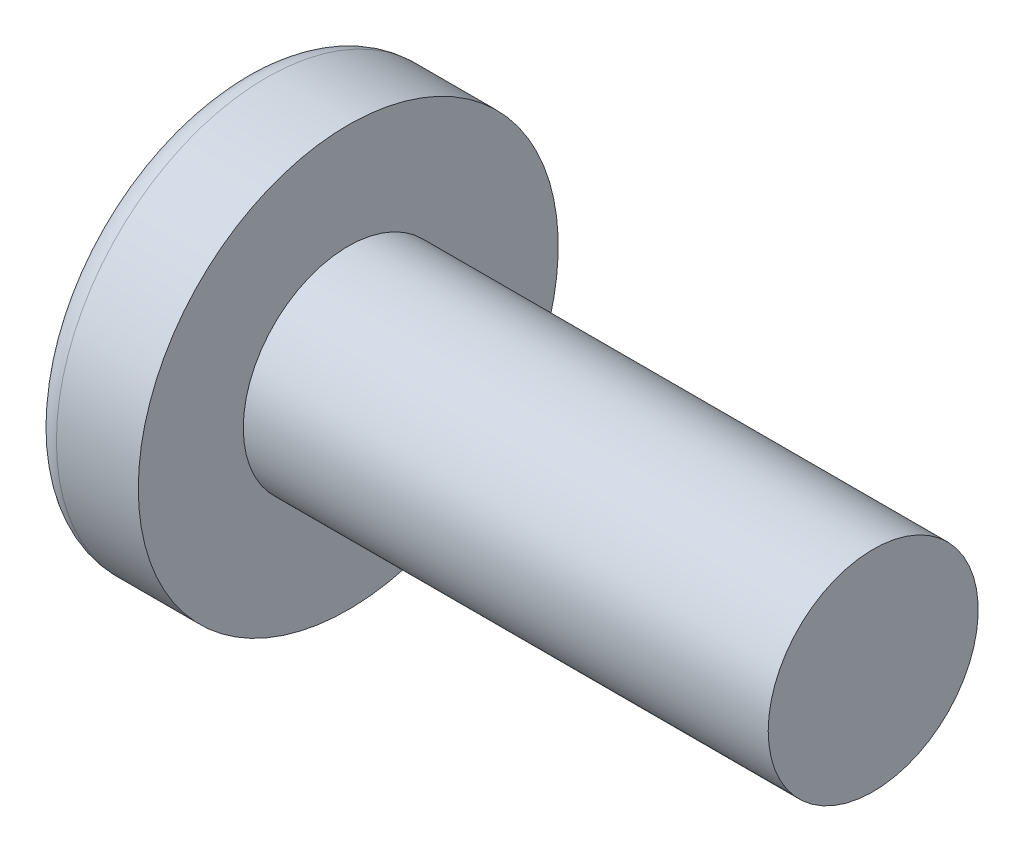
ISO-10303-21;
HEADER;
FILE_DESCRIPTION(('STEP AP214'),'2;1');
FILE_NAME('part.step','',(''),(''),'','','');
FILE_SCHEMA(('AUTOMOTIVE_DESIGN { 1 0 10303 214 1 1 1 1 }'));
ENDSEC;
DATA;
#1=APPLICATION_CONTEXT('core data for automotive mechanical design processes');
#2=APPLICATION_PROTOCOL_DEFINITION('international standard','automotive_design',2000,#1);
#3=PRODUCT_CONTEXT('',#1,'mechanical');
#4=PRODUCT('Part','Part','',(#3));
#5=PRODUCT_RELATED_PRODUCT_CATEGORY('part','',(#4));
#6=PRODUCT_DEFINITION_FORMATION('','',#4);
#7=PRODUCT_DEFINITION_CONTEXT('part definition',#1,'design');
#8=PRODUCT_DEFINITION('design','',#6,#7);
#9=PRODUCT_DEFINITION_SHAPE('','',#8);
#10=(LENGTH_UNIT() NAMED_UNIT(*) SI_UNIT(.MILLI.,.METRE.));
#11=(NAMED_UNIT(*) PLANE_ANGLE_UNIT() SI_UNIT($,.RADIAN.));
#12=(NAMED_UNIT(*) SI_UNIT($,.STERADIAN.) SOLID_ANGLE_UNIT());
#13=UNCERTAINTY_MEASURE_WITH_UNIT(LENGTH_MEASURE(1.E-05),#10,'distance_accuracy_value','');
#14=(GEOMETRIC_REPRESENTATION_CONTEXT(3) GLOBAL_UNCERTAINTY_ASSIGNED_CONTEXT((#13)) GLOBAL_UNIT_ASSIGNED_CONTEXT((#10,
#11,#12)) REPRESENTATION_CONTEXT('',''));
#15=CARTESIAN_POINT('',(0.,0.,0.));
#16=DIRECTION('',(0.,0.,1.));
#17=DIRECTION('',(1.,0.,0.));
#18=AXIS2_PLACEMENT_3D('',#15,#16,#17);
#19=CARTESIAN_POINT('',(3.2,0.,0.));
#20=DIRECTION('',(-1.,0.,0.));
#21=DIRECTION('',(0.,1.,0.));
#22=AXIS2_PLACEMENT_3D('',#19,#20,#21);
#23=SPHERICAL_SURFACE('',#22,3.2);
#24=CARTESIAN_POINT('',(0.627117875780583,0.,0.));
#25=DIRECTION('',(-1.,0.,0.));
#26=DIRECTION('',(0.,0.,1.));
#27=AXIS2_PLACEMENT_3D('',#24,#25,#26);
#28=CIRCLE('',#27,1.9027027027027);
#29=CARTESIAN_POINT('',(0.627117875780583,0.,1.9027027027027));
#30=VERTEX_POINT('',#29);
#31=EDGE_CURVE('E153',#30,#30,#28,.T.);
#32=ORIENTED_EDGE('',*,*,#31,.T.);
#33=EDGE_LOOP('',(#32));
#34=FACE_BOUND('',#33,.T.);
#35=CARTESIAN_POINT('',(3.19174554351625,-0.0818566934638239,0.));
#36=DIRECTION('',(-0.100331502261418,-0.994954064092392,0.));
#37=DIRECTION('',(0.994954064092392,-0.100331502261418,0.));
#38=AXIS2_PLACEMENT_3D('',#35,#36,#37);
#39=CIRCLE('',#38,3.1989422229361);
#40=CARTESIAN_POINT('',(0.118330716626357,0.228067490760365,0.83144431417242));
#41=VERTEX_POINT('',#40);
#42=CARTESIAN_POINT('',(0.0177814447975956,0.238206913129653,0.238206913129654));
#43=VERTEX_POINT('',#42);
#44=EDGE_CURVE('E184',#41,#43,#39,.T.);
#45=ORIENTED_EDGE('',*,*,#44,.F.);
#46=CARTESIAN_POINT('',(2.64043280070581,0.,-0.842892363493775));
#47=DIRECTION('',(0.553083521918191,0.,0.833125811497021));
#48=DIRECTION('',(0.833125811497021,0.,-0.553083521918191));
#49=AXIS2_PLACEMENT_3D('',#46,#47,#48);
#50=CIRCLE('',#49,3.03585523585001);
#51=CARTESIAN_POINT('',(0.118330716626356,-0.22806749076037,0.831444314172418));
#52=VERTEX_POINT('',#51);
#53=EDGE_CURVE('E149',#41,#52,#50,.T.);
#54=ORIENTED_EDGE('',*,*,#53,.T.);
#55=CARTESIAN_POINT('',(3.19174554351625,0.0818566934638237,0.));
#56=DIRECTION('',(-0.100331502261418,0.994954064092392,0.));
#57=DIRECTION('',(-0.994954064092392,-0.100331502261418,0.));
#58=AXIS2_PLACEMENT_3D('',#55,#56,#57);
#59=CIRCLE('',#58,3.1989422229361);
#60=CARTESIAN_POINT('',(0.0177814447975947,-0.238206913129655,0.238206913129654));
#61=VERTEX_POINT('',#60);
#62=EDGE_CURVE('E105',#61,#52,#59,.T.);
#63=ORIENTED_EDGE('',*,*,#62,.F.);
#64=CARTESIAN_POINT('',(3.19174554351625,0.,-0.0818566934638237));
#65=DIRECTION('',(-0.100331502261418,0.,-0.994954064092392));
#66=DIRECTION('',(-0.994954064092392,0.,0.100331502261418));
#67=AXIS2_PLACEMENT_3D('',#64,#65,#66);
#68=CIRCLE('',#67,3.1989422229361);
#69=CARTESIAN_POINT('',(0.118330716626357,-0.83144431417242,0.228067490760367));
#70=VERTEX_POINT('',#69);
#71=EDGE_CURVE('E130',#70,#61,#68,.T.);
#72=ORIENTED_EDGE('',*,*,#71,.F.);
#73=CARTESIAN_POINT('',(2.64043280070581,0.842892363493775,0.));
#74=DIRECTION('',(0.553083521918191,-0.833125811497021,0.));
#75=DIRECTION('',(0.833125811497021,0.553083521918191,0.));
#76=AXIS2_PLACEMENT_3D('',#73,#74,#75);
#77=CIRCLE('',#76,3.03585523585001);
#78=CARTESIAN_POINT('',(0.118330716626357,-0.831444314172419,-0.228067490760367));
#79=VERTEX_POINT('',#78);
#80=EDGE_CURVE('E138',#70,#79,#77,.T.);
#81=ORIENTED_EDGE('',*,*,#80,.T.);
#82=CARTESIAN_POINT('',(3.19174554351625,0.,0.0818566934638239));
#83=DIRECTION('',(-0.100331502261418,0.,0.994954064092392));
#84=DIRECTION('',(0.994954064092392,0.,0.100331502261418));
#85=AXIS2_PLACEMENT_3D('',#82,#83,#84);
#86=CIRCLE('',#85,3.1989422229361);
#87=CARTESIAN_POINT('',(0.0177814447975952,-0.238206913129653,-0.238206913129654));
#88=VERTEX_POINT('',#87);
#89=EDGE_CURVE('E48',#88,#79,#86,.T.);
#90=ORIENTED_EDGE('',*,*,#89,.F.);
#91=CARTESIAN_POINT('',(0.118330716626357,-0.228067490760364,-0.83144431417242));
#92=VERTEX_POINT('',#91);
#93=EDGE_CURVE('E191',#92,#88,#59,.T.);
#94=ORIENTED_EDGE('',*,*,#93,.F.);
#95=CARTESIAN_POINT('',(2.64043280070581,0.,0.842892363493775));
#96=DIRECTION('',(0.553083521918191,0.,-0.833125811497021));
#97=DIRECTION('',(-0.833125811497021,0.,-0.553083521918191));
#98=AXIS2_PLACEMENT_3D('',#95,#96,#97);
#99=CIRCLE('',#98,3.03585523585001);
#100=CARTESIAN_POINT('',(0.118330716626357,0.22806749076037,-0.831444314172418));
#101=VERTEX_POINT('',#100);
#102=EDGE_CURVE('E131',#92,#101,#99,.T.);
#103=ORIENTED_EDGE('',*,*,#102,.T.);
#104=CARTESIAN_POINT('',(0.0177814447975956,0.238206913129655,-0.238206913129654));
#105=VERTEX_POINT('',#104);
#106=EDGE_CURVE('E179',#105,#101,#39,.T.);
#107=ORIENTED_EDGE('',*,*,#106,.F.);
#108=CARTESIAN_POINT('',(0.118330716626356,0.831444314172419,-0.228067490760367));
#109=VERTEX_POINT('',#108);
#110=EDGE_CURVE('E41',#109,#105,#86,.T.);
#111=ORIENTED_EDGE('',*,*,#110,.F.);
#112=CARTESIAN_POINT('',(2.64043280070581,-0.842892363493776,0.));
#113=DIRECTION('',(0.553083521918191,0.833125811497021,0.));
#114=DIRECTION('',(-0.833125811497021,0.553083521918191,0.));
#115=AXIS2_PLACEMENT_3D('',#112,#113,#114);
#116=CIRCLE('',#115,3.03585523585001);
#117=CARTESIAN_POINT('',(0.118330716626357,0.831444314172419,0.228067490760367));
#118=VERTEX_POINT('',#117);
#119=EDGE_CURVE('E11',#109,#118,#116,.T.);
#120=ORIENTED_EDGE('',*,*,#119,.T.);
#121=EDGE_CURVE('E167',#43,#118,#68,.T.);
#122=ORIENTED_EDGE('',*,*,#121,.F.);
#123=EDGE_LOOP('',(#45,#54,#63,#72,#81,#90,#94,#103,#107,#111,#120,#122));
#124=FACE_BOUND('',#123,.T.);
#125=ADVANCED_FACE('F33',(#34,#124),#23,.T.);
#126=CARTESIAN_POINT('',(1.37075949367089,0.,-0.101772151898734));
#127=DIRECTION('',(-0.100331502261418,0.,0.994954064092392));
#128=DIRECTION('',(0.994954064092392,0.,0.100331502261418));
#129=AXIS2_PLACEMENT_3D('',#126,#127,#128);
#130=PLANE('',#129);
#131=ORIENTED_EDGE('',*,*,#110,.T.);
#132=DIRECTION('',(0.989983749746913,-0.0998302940921261,0.0998302940921257));
#133=VECTOR('',#132,1.);
#134=CARTESIAN_POINT('',(1.38081767298512,0.100757881715786,-0.100757881715786));
#135=LINE('',#134,#133);
#136=CARTESIAN_POINT('',(1.19,0.12,-0.12));
#137=VERTEX_POINT('',#136);
#138=EDGE_CURVE('E173',#105,#137,#135,.T.);
#139=ORIENTED_EDGE('',*,*,#138,.T.);
#140=DIRECTION('',(0.830201128729582,-0.551141925795269,0.083717760880294));
#141=VECTOR('',#140,1.);
#142=CARTESIAN_POINT('',(0.,0.91,-0.24));
#143=LINE('',#142,#141);
#144=EDGE_CURVE('E154',#109,#137,#143,.T.);
#145=ORIENTED_EDGE('',*,*,#144,.F.);
#146=EDGE_LOOP('',(#131,#139,#145));
#147=FACE_BOUND('',#146,.T.);
#148=ADVANCED_FACE('F172',(#147),#130,.T.);
#149=DIRECTION('',(0.830201128729582,0.551141925795269,0.083717760880294));
#150=VECTOR('',#149,1.);
#151=CARTESIAN_POINT('',(0.,-0.91,-0.24));
#152=LINE('',#151,#150);
#153=CARTESIAN_POINT('',(1.19,-0.12,-0.12));
#154=VERTEX_POINT('',#153);
#155=EDGE_CURVE('E139',#79,#154,#152,.T.);
#156=ORIENTED_EDGE('',*,*,#155,.T.);
#157=DIRECTION('',(-0.989983749746913,-0.0998302940921253,-0.0998302940921257));
#158=VECTOR('',#157,1.);
#159=CARTESIAN_POINT('',(1.38081767298512,-0.100757881715786,-0.100757881715786));
#160=LINE('',#159,#158);
#161=EDGE_CURVE('E194',#154,#88,#160,.T.);
#162=ORIENTED_EDGE('',*,*,#161,.T.);
#163=ORIENTED_EDGE('',*,*,#89,.T.);
#164=EDGE_LOOP('',(#156,#162,#163));
#165=FACE_BOUND('',#164,.T.);
#166=ADVANCED_FACE('F209',(#165),#130,.T.);
#167=CARTESIAN_POINT('',(1.37075949367089,0.,0.101772151898734));
#168=DIRECTION('',(-0.100331502261418,0.,-0.994954064092392));
#169=DIRECTION('',(-0.994954064092392,0.,0.100331502261418));
#170=AXIS2_PLACEMENT_3D('',#167,#168,#169);
#171=PLANE('',#170);
#172=DIRECTION('',(0.830201128729582,-0.551141925795269,-0.083717760880294));
#173=VECTOR('',#172,1.);
#174=CARTESIAN_POINT('',(0.,0.91,0.24));
#175=LINE('',#174,#173);
#176=CARTESIAN_POINT('',(1.19,0.12,0.12));
#177=VERTEX_POINT('',#176);
#178=EDGE_CURVE('E210',#118,#177,#175,.T.);
#179=ORIENTED_EDGE('',*,*,#178,.T.);
#180=DIRECTION('',(-0.989983749746913,0.0998302940921254,0.0998302940921256));
#181=VECTOR('',#180,1.);
#182=CARTESIAN_POINT('',(1.38081767298512,0.100757881715786,0.100757881715786));
#183=LINE('',#182,#181);
#184=EDGE_CURVE('E188',#177,#43,#183,.T.);
#185=ORIENTED_EDGE('',*,*,#184,.T.);
#186=ORIENTED_EDGE('',*,*,#121,.T.);
#187=EDGE_LOOP('',(#179,#185,#186));
#188=FACE_BOUND('',#187,.T.);
#189=ADVANCED_FACE('F214',(#188),#171,.T.);
#190=ORIENTED_EDGE('',*,*,#71,.T.);
#191=DIRECTION('',(0.989983749746913,0.099830294092126,-0.0998302940921256));
#192=VECTOR('',#191,1.);
#193=CARTESIAN_POINT('',(1.38081767298512,-0.100757881715786,0.100757881715786));
#194=LINE('',#193,#192);
#195=CARTESIAN_POINT('',(1.19,-0.12,0.12));
#196=VERTEX_POINT('',#195);
#197=EDGE_CURVE('E103',#61,#196,#194,.T.);
#198=ORIENTED_EDGE('',*,*,#197,.T.);
#199=DIRECTION('',(0.830201128729582,0.551141925795269,-0.0837177608802938));
#200=VECTOR('',#199,1.);
#201=CARTESIAN_POINT('',(0.,-0.910000000000001,0.24));
#202=LINE('',#201,#200);
#203=EDGE_CURVE('E128',#70,#196,#202,.T.);
#204=ORIENTED_EDGE('',*,*,#203,.F.);
#205=EDGE_LOOP('',(#190,#198,#204));
#206=FACE_BOUND('',#205,.T.);
#207=ADVANCED_FACE('F127',(#206),#171,.T.);
#208=CARTESIAN_POINT('',(-25.4,0.,0.));
#209=DIRECTION('',(-1.,0.,0.));
#210=DIRECTION('',(0.,0.,1.));
#211=AXIS2_PLACEMENT_3D('',#208,#209,#210);
#212=CYLINDRICAL_SURFACE('',#211,1.);
#213=CARTESIAN_POINT('',(6.6,0.,0.));
#214=DIRECTION('',(-1.,0.,0.));
#215=DIRECTION('',(0.,0.,1.));
#216=AXIS2_PLACEMENT_3D('',#213,#214,#215);
#217=CIRCLE('',#216,1.);
#218=CARTESIAN_POINT('',(6.6,0.,1.));
#219=VERTEX_POINT('',#218);
#220=EDGE_CURVE('E150',#219,#219,#217,.T.);
#221=ORIENTED_EDGE('',*,*,#220,.T.);
#222=EDGE_LOOP('',(#221));
#223=FACE_BOUND('',#222,.T.);
#224=CARTESIAN_POINT('',(1.6,0.,0.));
#225=DIRECTION('',(-1.,0.,0.));
#226=DIRECTION('',(0.,0.,1.));
#227=AXIS2_PLACEMENT_3D('',#224,#225,#226);
#228=CIRCLE('',#227,1.);
#229=CARTESIAN_POINT('',(1.6,0.,1.));
#230=VERTEX_POINT('',#229);
#231=EDGE_CURVE('E163',#230,#230,#228,.T.);
#232=ORIENTED_EDGE('',*,*,#231,.F.);
#233=EDGE_LOOP('',(#232));
#234=FACE_BOUND('',#233,.T.);
#235=ADVANCED_FACE('F35',(#223,#234),#212,.T.);
#236=CARTESIAN_POINT('',(1.6,1.,0.));
#237=DIRECTION('',(-1.,0.,0.));
#238=DIRECTION('',(0.,0.,1.));
#239=AXIS2_PLACEMENT_3D('',#236,#237,#238);
#240=PLANE('',#239);
#241=CARTESIAN_POINT('',(1.6,0.,0.));
#242=DIRECTION('',(-1.,0.,0.));
#243=DIRECTION('',(0.,0.,1.));
#244=AXIS2_PLACEMENT_3D('',#241,#242,#243);
#245=CIRCLE('',#244,2.);
#246=CARTESIAN_POINT('',(1.6,0.,2.));
#247=VERTEX_POINT('',#246);
#248=EDGE_CURVE('E160',#247,#247,#245,.T.);
#249=ORIENTED_EDGE('',*,*,#248,.F.);
#250=EDGE_LOOP('',(#249));
#251=FACE_BOUND('',#250,.T.);
#252=ORIENTED_EDGE('',*,*,#231,.T.);
#253=EDGE_LOOP('',(#252));
#254=FACE_BOUND('',#253,.T.);
#255=ADVANCED_FACE('F242',(#251,#254),#240,.F.);
#256=CARTESIAN_POINT('',(-25.4,0.,0.));
#257=DIRECTION('',(-1.,0.,0.));
#258=DIRECTION('',(0.,0.,1.));
#259=AXIS2_PLACEMENT_3D('',#256,#257,#258);
#260=CYLINDRICAL_SURFACE('',#259,2.);
#261=ORIENTED_EDGE('',*,*,#248,.T.);
#262=EDGE_LOOP('',(#261));
#263=FACE_BOUND('',#262,.T.);
#264=CARTESIAN_POINT('',(0.820084035097039,0.,0.));
#265=DIRECTION('',(-1.,0.,0.));
#266=DIRECTION('',(0.,0.,1.));
#267=AXIS2_PLACEMENT_3D('',#264,#265,#266);
#268=CIRCLE('',#267,2.);
#269=CARTESIAN_POINT('',(0.820084035097039,0.,2.));
#270=VERTEX_POINT('',#269);
#271=EDGE_CURVE('E157',#270,#270,#268,.T.);
#272=ORIENTED_EDGE('',*,*,#271,.F.);
#273=EDGE_LOOP('',(#272));
#274=FACE_BOUND('',#273,.T.);
#275=ADVANCED_FACE('F239',(#263,#274),#260,.T.);
#276=CARTESIAN_POINT('',(0.820084035097038,0.,0.));
#277=DIRECTION('',(-1.,0.,0.));
#278=DIRECTION('',(0.,0.,1.));
#279=AXIS2_PLACEMENT_3D('',#276,#277,#278);
#280=TOROIDAL_SURFACE('',#279,1.76,0.24);
#281=ORIENTED_EDGE('',*,*,#271,.T.);
#282=EDGE_LOOP('',(#281));
#283=FACE_BOUND('',#282,.T.);
#284=ORIENTED_EDGE('',*,*,#31,.F.);
#285=EDGE_LOOP('',(#284));
#286=FACE_BOUND('',#285,.T.);
#287=ADVANCED_FACE('F236',(#283,#286),#280,.T.);
#288=CARTESIAN_POINT('',(6.6,1.,0.));
#289=DIRECTION('',(1.,0.,0.));
#290=DIRECTION('',(0.,0.,-1.));
#291=AXIS2_PLACEMENT_3D('',#288,#289,#290);
#292=PLANE('',#291);
#293=ORIENTED_EDGE('',*,*,#220,.F.);
#294=EDGE_LOOP('',(#293));
#295=FACE_BOUND('',#294,.T.);
#296=ADVANCED_FACE('F234',(#295),#292,.T.);
#297=CARTESIAN_POINT('',(1.19,0.12,0.12));
#298=DIRECTION('',(0.553083521918191,0.833125811497021,0.));
#299=DIRECTION('',(-0.833125811497021,0.553083521918191,0.));
#300=AXIS2_PLACEMENT_3D('',#297,#298,#299);
#301=PLANE('',#300);
#302=ORIENTED_EDGE('',*,*,#144,.T.);
#303=DIRECTION('',(0.,0.,-1.));
#304=VECTOR('',#303,1.);
#305=CARTESIAN_POINT('',(1.19,0.12,0.12));
#306=LINE('',#305,#304);
#307=EDGE_CURVE('E121',#177,#137,#306,.T.);
#308=ORIENTED_EDGE('',*,*,#307,.F.);
#309=ORIENTED_EDGE('',*,*,#178,.F.);
#310=ORIENTED_EDGE('',*,*,#119,.F.);
#311=EDGE_LOOP('',(#302,#308,#309,#310));
#312=FACE_BOUND('',#311,.T.);
#313=ADVANCED_FACE('F213',(#312),#301,.F.);
#314=CARTESIAN_POINT('',(0.,-0.91,-0.24));
#315=DIRECTION('',(0.553083521918191,-0.833125811497021,0.));
#316=DIRECTION('',(0.833125811497021,0.553083521918191,0.));
#317=AXIS2_PLACEMENT_3D('',#314,#315,#316);
#318=PLANE('',#317);
#319=ORIENTED_EDGE('',*,*,#203,.T.);
#320=DIRECTION('',(0.,0.,1.));
#321=VECTOR('',#320,1.);
#322=CARTESIAN_POINT('',(1.19,-0.12,-0.12));
#323=LINE('',#322,#321);
#324=EDGE_CURVE('E120',#154,#196,#323,.T.);
#325=ORIENTED_EDGE('',*,*,#324,.F.);
#326=ORIENTED_EDGE('',*,*,#155,.F.);
#327=ORIENTED_EDGE('',*,*,#80,.F.);
#328=EDGE_LOOP('',(#319,#325,#326,#327));
#329=FACE_BOUND('',#328,.T.);
#330=ADVANCED_FACE('F135',(#329),#318,.F.);
#331=CARTESIAN_POINT('',(1.19,0.12,-0.12));
#332=DIRECTION('',(-1.,0.,0.));
#333=DIRECTION('',(0.,0.,1.));
#334=AXIS2_PLACEMENT_3D('',#331,#332,#333);
#335=PLANE('',#334);
#336=DIRECTION('',(0.,1.,0.));
#337=VECTOR('',#336,1.);
#338=CARTESIAN_POINT('',(1.19,-0.12,-0.12));
#339=LINE('',#338,#337);
#340=EDGE_CURVE('E143',#154,#137,#339,.T.);
#341=ORIENTED_EDGE('',*,*,#340,.F.);
#342=ORIENTED_EDGE('',*,*,#324,.T.);
#343=DIRECTION('',(0.,-1.,0.));
#344=VECTOR('',#343,1.);
#345=CARTESIAN_POINT('',(1.19,0.12,0.12));
#346=LINE('',#345,#344);
#347=EDGE_CURVE('E112',#177,#196,#346,.T.);
#348=ORIENTED_EDGE('',*,*,#347,.F.);
#349=ORIENTED_EDGE('',*,*,#307,.T.);
#350=EDGE_LOOP('',(#341,#342,#348,#349));
#351=FACE_BOUND('',#350,.T.);
#352=ADVANCED_FACE('F141',(#351),#335,.T.);
#353=CARTESIAN_POINT('',(0.,0.240000000000003,-0.91));
#354=DIRECTION('',(0.553083521918191,0.,-0.833125811497021));
#355=DIRECTION('',(0.833125811497021,0.,0.553083521918191));
#356=AXIS2_PLACEMENT_3D('',#353,#354,#355);
#357=PLANE('',#356);
#358=DIRECTION('',(0.830201128729582,0.0837177608802919,0.55114192579527));
#359=VECTOR('',#358,1.);
#360=CARTESIAN_POINT('',(0.,-0.239999999999997,-0.910000000000001));
#361=LINE('',#360,#359);
#362=EDGE_CURVE('E199',#92,#154,#361,.T.);
#363=ORIENTED_EDGE('',*,*,#362,.T.);
#364=ORIENTED_EDGE('',*,*,#340,.T.);
#365=DIRECTION('',(0.830201128729582,-0.0837177608802959,0.551141925795269));
#366=VECTOR('',#365,1.);
#367=CARTESIAN_POINT('',(0.,0.240000000000003,-0.91));
#368=LINE('',#367,#366);
#369=EDGE_CURVE('E109',#101,#137,#368,.T.);
#370=ORIENTED_EDGE('',*,*,#369,.F.);
#371=ORIENTED_EDGE('',*,*,#102,.F.);
#372=EDGE_LOOP('',(#363,#364,#370,#371));
#373=FACE_BOUND('',#372,.T.);
#374=ADVANCED_FACE('F204',(#373),#357,.F.);
#375=CARTESIAN_POINT('',(1.37075949367089,-0.101772151898734,0.));
#376=DIRECTION('',(-0.100331502261418,0.994954064092392,0.));
#377=DIRECTION('',(-0.994954064092392,-0.100331502261418,0.));
#378=AXIS2_PLACEMENT_3D('',#375,#376,#377);
#379=PLANE('',#378);
#380=ORIENTED_EDGE('',*,*,#93,.T.);
#381=ORIENTED_EDGE('',*,*,#161,.F.);
#382=ORIENTED_EDGE('',*,*,#362,.F.);
#383=EDGE_LOOP('',(#380,#381,#382));
#384=FACE_BOUND('',#383,.T.);
#385=ADVANCED_FACE('F208',(#384),#379,.T.);
#386=CARTESIAN_POINT('',(1.37075949367089,0.101772151898734,0.));
#387=DIRECTION('',(-0.100331502261418,-0.994954064092392,0.));
#388=DIRECTION('',(0.994954064092392,-0.100331502261418,0.));
#389=AXIS2_PLACEMENT_3D('',#386,#387,#388);
#390=PLANE('',#389);
#391=ORIENTED_EDGE('',*,*,#106,.T.);
#392=ORIENTED_EDGE('',*,*,#369,.T.);
#393=ORIENTED_EDGE('',*,*,#138,.F.);
#394=EDGE_LOOP('',(#391,#392,#393));
#395=FACE_BOUND('',#394,.T.);
#396=ADVANCED_FACE('F202',(#395),#390,.T.);
#397=CARTESIAN_POINT('',(1.19,-0.12,0.12));
#398=DIRECTION('',(0.553083521918191,0.,0.833125811497021));
#399=DIRECTION('',(-0.833125811497021,0.,0.553083521918191));
#400=AXIS2_PLACEMENT_3D('',#397,#398,#399);
#401=PLANE('',#400);
#402=DIRECTION('',(0.830201128729582,-0.0837177608802921,-0.551141925795269));
#403=VECTOR('',#402,1.);
#404=CARTESIAN_POINT('',(0.,0.239999999999997,0.910000000000001));
#405=LINE('',#404,#403);
#406=EDGE_CURVE('E108',#41,#177,#405,.T.);
#407=ORIENTED_EDGE('',*,*,#406,.T.);
#408=ORIENTED_EDGE('',*,*,#347,.T.);
#409=DIRECTION('',(0.830201128729582,0.0837177608802959,-0.551141925795269));
#410=VECTOR('',#409,1.);
#411=CARTESIAN_POINT('',(0.,-0.240000000000003,0.909999999999999));
#412=LINE('',#411,#410);
#413=EDGE_CURVE('E99',#52,#196,#412,.T.);
#414=ORIENTED_EDGE('',*,*,#413,.F.);
#415=ORIENTED_EDGE('',*,*,#53,.F.);
#416=EDGE_LOOP('',(#407,#408,#414,#415));
#417=FACE_BOUND('',#416,.T.);
#418=ADVANCED_FACE('F113',(#417),#401,.F.);
#419=ORIENTED_EDGE('',*,*,#44,.T.);
#420=ORIENTED_EDGE('',*,*,#184,.F.);
#421=ORIENTED_EDGE('',*,*,#406,.F.);
#422=EDGE_LOOP('',(#419,#420,#421));
#423=FACE_BOUND('',#422,.T.);
#424=ADVANCED_FACE('F215',(#423),#390,.T.);
#425=ORIENTED_EDGE('',*,*,#62,.T.);
#426=ORIENTED_EDGE('',*,*,#413,.T.);
#427=ORIENTED_EDGE('',*,*,#197,.F.);
#428=EDGE_LOOP('',(#425,#426,#427));
#429=FACE_BOUND('',#428,.T.);
#430=ADVANCED_FACE('F101',(#429),#379,.T.);
#431=CLOSED_SHELL('',(#125,#148,#166,#189,#207,#235,#255,#275,#287,#296,#313,#330,#352,#374,
#385,#396,#418,#424,#430));
#432=MANIFOLD_SOLID_BREP('B2',#431);
#433=ADVANCED_BREP_SHAPE_REPRESENTATION('',(#18,#432),#14);
#434=SHAPE_DEFINITION_REPRESENTATION(#9,#433);
ENDSEC;
END-ISO-10303-21;
